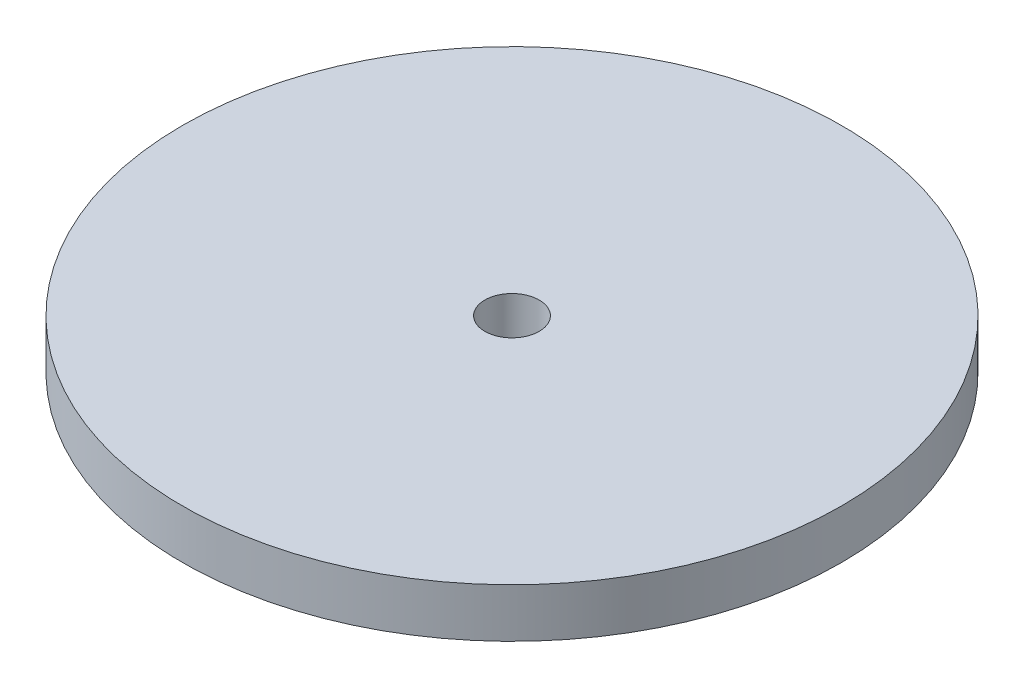
ISO-10303-21;
HEADER;
FILE_DESCRIPTION(('STEP AP214'),'2;1');
FILE_NAME('part.step','',(''),(''),'','','');
FILE_SCHEMA(('AUTOMOTIVE_DESIGN { 1 0 10303 214 1 1 1 1 }'));
ENDSEC;
DATA;
#1=APPLICATION_CONTEXT('core data for automotive mechanical design processes');
#2=APPLICATION_PROTOCOL_DEFINITION('international standard','automotive_design',2000,#1);
#3=PRODUCT_CONTEXT('',#1,'mechanical');
#4=PRODUCT('Part','Part','',(#3));
#5=PRODUCT_RELATED_PRODUCT_CATEGORY('part','',(#4));
#6=PRODUCT_DEFINITION_FORMATION('','',#4);
#7=PRODUCT_DEFINITION_CONTEXT('part definition',#1,'design');
#8=PRODUCT_DEFINITION('design','',#6,#7);
#9=PRODUCT_DEFINITION_SHAPE('','',#8);
#10=(LENGTH_UNIT() NAMED_UNIT(*) SI_UNIT(.MILLI.,.METRE.));
#11=(NAMED_UNIT(*) PLANE_ANGLE_UNIT() SI_UNIT($,.RADIAN.));
#12=(NAMED_UNIT(*) SI_UNIT($,.STERADIAN.) SOLID_ANGLE_UNIT());
#13=UNCERTAINTY_MEASURE_WITH_UNIT(LENGTH_MEASURE(1.E-05),#10,'distance_accuracy_value','');
#14=(GEOMETRIC_REPRESENTATION_CONTEXT(3) GLOBAL_UNCERTAINTY_ASSIGNED_CONTEXT((#13)) GLOBAL_UNIT_ASSIGNED_CONTEXT((#10,
#11,#12)) REPRESENTATION_CONTEXT('',''));
#15=CARTESIAN_POINT('',(0.,0.,0.));
#16=DIRECTION('',(0.,0.,1.));
#17=DIRECTION('',(1.,0.,0.));
#18=AXIS2_PLACEMENT_3D('',#15,#16,#17);
#19=CARTESIAN_POINT('',(20.1352815370627,9.32125442735246,0.));
#20=DIRECTION('',(0.,1.,0.));
#21=DIRECTION('',(-1.,0.,0.));
#22=AXIS2_PLACEMENT_3D('',#19,#20,#21);
#23=PLANE('',#22);
#24=CARTESIAN_POINT('',(0.135281537062731,9.32125442735245,0.));
#25=DIRECTION('',(0.,-1.,0.));
#26=DIRECTION('',(1.,0.,0.));
#27=AXIS2_PLACEMENT_3D('',#24,#25,#26);
#28=CIRCLE('',#27,1.65);
#29=CARTESIAN_POINT('',(1.78528153706273,9.32125442735245,0.));
#30=VERTEX_POINT('',#29);
#31=EDGE_CURVE('E11',#30,#30,#28,.T.);
#32=ORIENTED_EDGE('',*,*,#31,.T.);
#33=EDGE_LOOP('',(#32));
#34=FACE_BOUND('',#33,.T.);
#35=CARTESIAN_POINT('',(0.135281537062731,9.32125442735245,0.));
#36=DIRECTION('',(0.,-1.,0.));
#37=DIRECTION('',(1.,0.,0.));
#38=AXIS2_PLACEMENT_3D('',#35,#36,#37);
#39=CIRCLE('',#38,20.);
#40=CARTESIAN_POINT('',(20.1352815370627,9.32125442735246,0.));
#41=VERTEX_POINT('',#40);
#42=EDGE_CURVE('E53',#41,#41,#39,.T.);
#43=ORIENTED_EDGE('',*,*,#42,.F.);
#44=EDGE_LOOP('',(#43));
#45=FACE_BOUND('',#44,.T.);
#46=ADVANCED_FACE('F36',(#34,#45),#23,.T.);
#47=CARTESIAN_POINT('',(0.135281537062731,9.32125442735245,0.));
#48=DIRECTION('',(0.,-1.,0.));
#49=DIRECTION('',(1.,0.,0.));
#50=AXIS2_PLACEMENT_3D('',#47,#48,#49);
#51=CYLINDRICAL_SURFACE('',#50,1.65);
#52=CARTESIAN_POINT('',(0.135281537062732,6.34578519891457,0.));
#53=DIRECTION('',(0.,-1.,0.));
#54=DIRECTION('',(1.,0.,0.));
#55=AXIS2_PLACEMENT_3D('',#52,#53,#54);
#56=CIRCLE('',#55,1.65);
#57=CARTESIAN_POINT('',(1.78528153706273,6.34578519891457,0.));
#58=VERTEX_POINT('',#57);
#59=EDGE_CURVE('E44',#58,#58,#56,.T.);
#60=ORIENTED_EDGE('',*,*,#59,.T.);
#61=EDGE_LOOP('',(#60));
#62=FACE_BOUND('',#61,.T.);
#63=ORIENTED_EDGE('',*,*,#31,.F.);
#64=EDGE_LOOP('',(#63));
#65=FACE_BOUND('',#64,.T.);
#66=ADVANCED_FACE('F63',(#62,#65),#51,.F.);
#67=CARTESIAN_POINT('',(1.78528153706273,6.34578519891457,0.));
#68=DIRECTION('',(0.,-1.,0.));
#69=DIRECTION('',(1.,0.,0.));
#70=AXIS2_PLACEMENT_3D('',#67,#68,#69);
#71=PLANE('',#70);
#72=CARTESIAN_POINT('',(0.135281537062732,6.34578519891457,0.));
#73=DIRECTION('',(0.,-1.,0.));
#74=DIRECTION('',(1.,0.,0.));
#75=AXIS2_PLACEMENT_3D('',#72,#73,#74);
#76=CIRCLE('',#75,20.);
#77=CARTESIAN_POINT('',(20.1352815370627,6.34578519891457,0.));
#78=VERTEX_POINT('',#77);
#79=EDGE_CURVE('E49',#78,#78,#76,.T.);
#80=ORIENTED_EDGE('',*,*,#79,.T.);
#81=EDGE_LOOP('',(#80));
#82=FACE_BOUND('',#81,.T.);
#83=ORIENTED_EDGE('',*,*,#59,.F.);
#84=EDGE_LOOP('',(#83));
#85=FACE_BOUND('',#84,.T.);
#86=ADVANCED_FACE('F67',(#82,#85),#71,.T.);
#87=CARTESIAN_POINT('',(0.135281537062731,9.32125442735245,0.));
#88=DIRECTION('',(0.,-1.,0.));
#89=DIRECTION('',(1.,0.,0.));
#90=AXIS2_PLACEMENT_3D('',#87,#88,#89);
#91=CYLINDRICAL_SURFACE('',#90,20.);
#92=ORIENTED_EDGE('',*,*,#42,.T.);
#93=EDGE_LOOP('',(#92));
#94=FACE_BOUND('',#93,.T.);
#95=ORIENTED_EDGE('',*,*,#79,.F.);
#96=EDGE_LOOP('',(#95));
#97=FACE_BOUND('',#96,.T.);
#98=ADVANCED_FACE('F59',(#94,#97),#91,.T.);
#99=CLOSED_SHELL('',(#46,#66,#86,#98));
#100=MANIFOLD_SOLID_BREP('B2',#99);
#101=ADVANCED_BREP_SHAPE_REPRESENTATION('',(#18,#100),#14);
#102=SHAPE_DEFINITION_REPRESENTATION(#9,#101);
ENDSEC;
END-ISO-10303-21;
